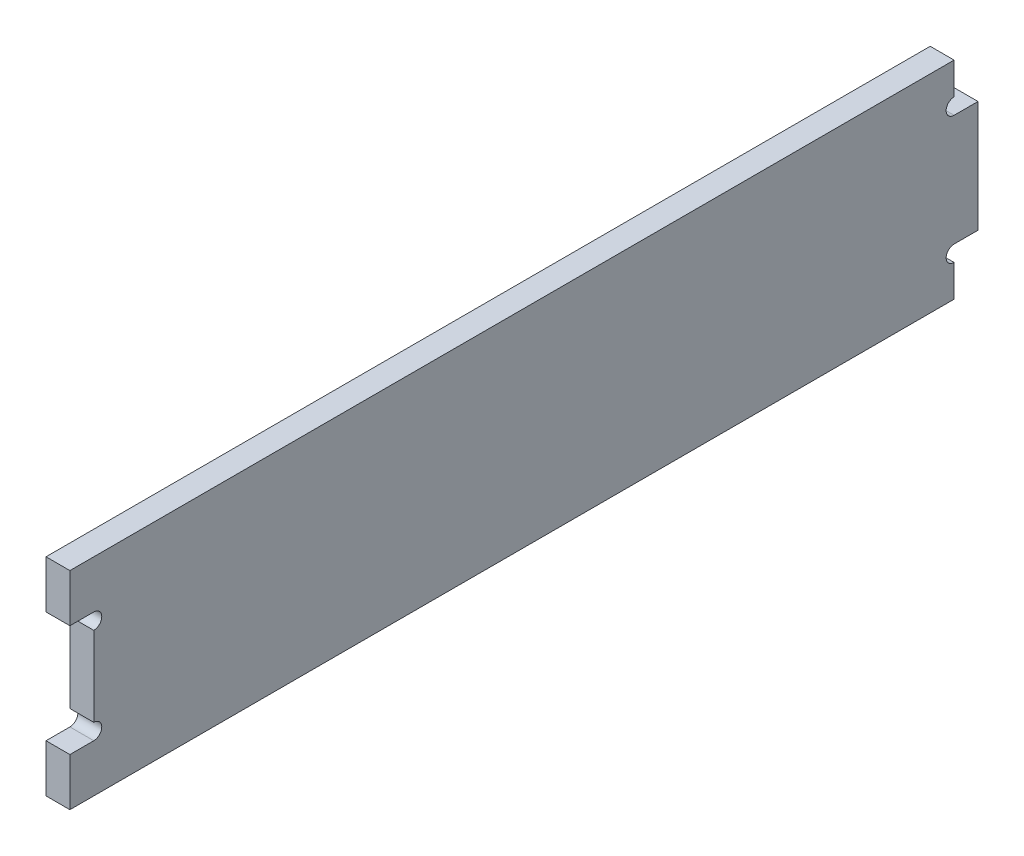
ISO-10303-21;
HEADER;
FILE_DESCRIPTION(('STEP AP214'),'2;1');
FILE_NAME('part.step','',(''),(''),'','','');
FILE_SCHEMA(('AUTOMOTIVE_DESIGN { 1 0 10303 214 1 1 1 1 }'));
ENDSEC;
DATA;
#1=APPLICATION_CONTEXT('core data for automotive mechanical design processes');
#2=APPLICATION_PROTOCOL_DEFINITION('international standard','automotive_design',2000,#1);
#3=PRODUCT_CONTEXT('',#1,'mechanical');
#4=PRODUCT('Part','Part','',(#3));
#5=PRODUCT_RELATED_PRODUCT_CATEGORY('part','',(#4));
#6=PRODUCT_DEFINITION_FORMATION('','',#4);
#7=PRODUCT_DEFINITION_CONTEXT('part definition',#1,'design');
#8=PRODUCT_DEFINITION('design','',#6,#7);
#9=PRODUCT_DEFINITION_SHAPE('','',#8);
#10=(LENGTH_UNIT() NAMED_UNIT(*) SI_UNIT(.MILLI.,.METRE.));
#11=(NAMED_UNIT(*) PLANE_ANGLE_UNIT() SI_UNIT($,.RADIAN.));
#12=(NAMED_UNIT(*) SI_UNIT($,.STERADIAN.) SOLID_ANGLE_UNIT());
#13=UNCERTAINTY_MEASURE_WITH_UNIT(LENGTH_MEASURE(1.E-05),#10,'distance_accuracy_value','');
#14=(GEOMETRIC_REPRESENTATION_CONTEXT(3) GLOBAL_UNCERTAINTY_ASSIGNED_CONTEXT((#13)) GLOBAL_UNIT_ASSIGNED_CONTEXT((#10,
#11,#12)) REPRESENTATION_CONTEXT('',''));
#15=CARTESIAN_POINT('',(0.,0.,0.));
#16=DIRECTION('',(0.,0.,1.));
#17=DIRECTION('',(1.,0.,0.));
#18=AXIS2_PLACEMENT_3D('',#15,#16,#17);
#19=CARTESIAN_POINT('',(3.,0.,0.));
#20=DIRECTION('',(0.,0.,-1.));
#21=DIRECTION('',(-1.,0.,0.));
#22=AXIS2_PLACEMENT_3D('',#19,#20,#21);
#23=PLANE('',#22);
#24=DIRECTION('',(0.,-1.,0.));
#25=VECTOR('',#24,1.);
#26=CARTESIAN_POINT('',(0.,0.,0.));
#27=LINE('',#26,#25);
#28=CARTESIAN_POINT('',(0.,26.,0.));
#29=VERTEX_POINT('',#28);
#30=CARTESIAN_POINT('',(0.,20.,0.));
#31=VERTEX_POINT('',#30);
#32=EDGE_CURVE('E251',#29,#31,#27,.T.);
#33=ORIENTED_EDGE('',*,*,#32,.T.);
#34=DIRECTION('',(1.,0.,0.));
#35=VECTOR('',#34,1.);
#36=CARTESIAN_POINT('',(-2.,20.,0.));
#37=LINE('',#36,#35);
#38=CARTESIAN_POINT('',(3.,20.,0.));
#39=VERTEX_POINT('',#38);
#40=EDGE_CURVE('E176',#31,#39,#37,.T.);
#41=ORIENTED_EDGE('',*,*,#40,.T.);
#42=DIRECTION('',(0.,-1.,0.));
#43=VECTOR('',#42,1.);
#44=CARTESIAN_POINT('',(3.,0.,0.));
#45=LINE('',#44,#43);
#46=CARTESIAN_POINT('',(3.,26.,0.));
#47=VERTEX_POINT('',#46);
#48=EDGE_CURVE('E282',#47,#39,#45,.T.);
#49=ORIENTED_EDGE('',*,*,#48,.F.);
#50=DIRECTION('',(-1.,0.,0.));
#51=VECTOR('',#50,1.);
#52=CARTESIAN_POINT('',(3.,26.,0.));
#53=LINE('',#52,#51);
#54=EDGE_CURVE('E250',#47,#29,#53,.T.);
#55=ORIENTED_EDGE('',*,*,#54,.T.);
#56=EDGE_LOOP('',(#33,#41,#49,#55));
#57=FACE_BOUND('',#56,.T.);
#58=ADVANCED_FACE('F35',(#57),#23,.F.);
#59=CARTESIAN_POINT('',(3.,0.,-111.));
#60=DIRECTION('',(0.,0.,1.));
#61=DIRECTION('',(1.,0.,0.));
#62=AXIS2_PLACEMENT_3D('',#59,#60,#61);
#63=PLANE('',#62);
#64=DIRECTION('',(0.,1.,0.));
#65=VECTOR('',#64,1.);
#66=CARTESIAN_POINT('',(3.,0.,-111.));
#67=LINE('',#66,#65);
#68=CARTESIAN_POINT('',(3.,22.,-111.));
#69=VERTEX_POINT('',#68);
#70=CARTESIAN_POINT('',(3.,26.,-111.));
#71=VERTEX_POINT('',#70);
#72=EDGE_CURVE('E225',#69,#71,#67,.T.);
#73=ORIENTED_EDGE('',*,*,#72,.F.);
#74=DIRECTION('',(1.,0.,0.));
#75=VECTOR('',#74,1.);
#76=CARTESIAN_POINT('',(-7.,22.,-111.));
#77=LINE('',#76,#75);
#78=CARTESIAN_POINT('',(0.,22.,-111.));
#79=VERTEX_POINT('',#78);
#80=EDGE_CURVE('E172',#69,#79,#77,.F.);
#81=ORIENTED_EDGE('',*,*,#80,.T.);
#82=DIRECTION('',(0.,1.,0.));
#83=VECTOR('',#82,1.);
#84=CARTESIAN_POINT('',(0.,0.,-111.));
#85=LINE('',#84,#83);
#86=CARTESIAN_POINT('',(0.,26.,-111.));
#87=VERTEX_POINT('',#86);
#88=EDGE_CURVE('E221',#79,#87,#85,.T.);
#89=ORIENTED_EDGE('',*,*,#88,.T.);
#90=DIRECTION('',(-1.,0.,0.));
#91=VECTOR('',#90,1.);
#92=CARTESIAN_POINT('',(3.,26.,-111.));
#93=LINE('',#92,#91);
#94=EDGE_CURVE('E274',#71,#87,#93,.T.);
#95=ORIENTED_EDGE('',*,*,#94,.F.);
#96=EDGE_LOOP('',(#73,#81,#89,#95));
#97=FACE_BOUND('',#96,.T.);
#98=ADVANCED_FACE('F336',(#97),#63,.F.);
#99=CARTESIAN_POINT('',(3.,6.,0.));
#100=VERTEX_POINT('',#99);
#101=CARTESIAN_POINT('',(3.,0.,0.));
#102=VERTEX_POINT('',#101);
#103=EDGE_CURVE('E290',#100,#102,#45,.T.);
#104=ORIENTED_EDGE('',*,*,#103,.F.);
#105=DIRECTION('',(1.,0.,0.));
#106=VECTOR('',#105,1.);
#107=CARTESIAN_POINT('',(-2.,6.,0.));
#108=LINE('',#107,#106);
#109=CARTESIAN_POINT('',(0.,6.,0.));
#110=VERTEX_POINT('',#109);
#111=EDGE_CURVE('E170',#110,#100,#108,.T.);
#112=ORIENTED_EDGE('',*,*,#111,.F.);
#113=CARTESIAN_POINT('',(0.,0.,0.));
#114=VERTEX_POINT('',#113);
#115=EDGE_CURVE('E203',#110,#114,#27,.T.);
#116=ORIENTED_EDGE('',*,*,#115,.T.);
#117=DIRECTION('',(-1.,0.,0.));
#118=VECTOR('',#117,1.);
#119=CARTESIAN_POINT('',(3.,0.,0.));
#120=LINE('',#119,#118);
#121=EDGE_CURVE('E217',#102,#114,#120,.T.);
#122=ORIENTED_EDGE('',*,*,#121,.F.);
#123=EDGE_LOOP('',(#104,#112,#116,#122));
#124=FACE_BOUND('',#123,.T.);
#125=ADVANCED_FACE('F37',(#124),#23,.F.);
#126=CARTESIAN_POINT('',(3.,0.,0.));
#127=DIRECTION('',(0.,1.,0.));
#128=DIRECTION('',(0.,0.,1.));
#129=AXIS2_PLACEMENT_3D('',#126,#127,#128);
#130=PLANE('',#129);
#131=DIRECTION('',(0.,0.,-1.));
#132=VECTOR('',#131,1.);
#133=CARTESIAN_POINT('',(0.,0.,0.));
#134=LINE('',#133,#132);
#135=CARTESIAN_POINT('',(0.,0.,-111.));
#136=VERTEX_POINT('',#135);
#137=EDGE_CURVE('E224',#114,#136,#134,.T.);
#138=ORIENTED_EDGE('',*,*,#137,.T.);
#139=DIRECTION('',(-1.,0.,0.));
#140=VECTOR('',#139,1.);
#141=CARTESIAN_POINT('',(3.,0.,-111.));
#142=LINE('',#141,#140);
#143=CARTESIAN_POINT('',(3.,0.,-111.));
#144=VERTEX_POINT('',#143);
#145=EDGE_CURVE('E273',#144,#136,#142,.T.);
#146=ORIENTED_EDGE('',*,*,#145,.F.);
#147=DIRECTION('',(0.,0.,-1.));
#148=VECTOR('',#147,1.);
#149=CARTESIAN_POINT('',(3.,0.,0.));
#150=LINE('',#149,#148);
#151=EDGE_CURVE('E247',#102,#144,#150,.T.);
#152=ORIENTED_EDGE('',*,*,#151,.F.);
#153=ORIENTED_EDGE('',*,*,#121,.T.);
#154=EDGE_LOOP('',(#138,#146,#152,#153));
#155=FACE_BOUND('',#154,.T.);
#156=ADVANCED_FACE('F272',(#155),#130,.F.);
#157=CARTESIAN_POINT('',(0.,4.,-111.));
#158=VERTEX_POINT('',#157);
#159=EDGE_CURVE('E223',#136,#158,#85,.T.);
#160=ORIENTED_EDGE('',*,*,#159,.T.);
#161=DIRECTION('',(1.,0.,0.));
#162=VECTOR('',#161,1.);
#163=CARTESIAN_POINT('',(-7.,4.,-111.));
#164=LINE('',#163,#162);
#165=CARTESIAN_POINT('',(3.,4.,-111.));
#166=VERTEX_POINT('',#165);
#167=EDGE_CURVE('E316',#158,#166,#164,.T.);
#168=ORIENTED_EDGE('',*,*,#167,.T.);
#169=EDGE_CURVE('E239',#144,#166,#67,.T.);
#170=ORIENTED_EDGE('',*,*,#169,.F.);
#171=ORIENTED_EDGE('',*,*,#145,.T.);
#172=EDGE_LOOP('',(#160,#168,#170,#171));
#173=FACE_BOUND('',#172,.T.);
#174=ADVANCED_FACE('F361',(#173),#63,.F.);
#175=CARTESIAN_POINT('',(3.,26.,0.));
#176=DIRECTION('',(0.,-1.,0.));
#177=DIRECTION('',(0.,0.,-1.));
#178=AXIS2_PLACEMENT_3D('',#175,#176,#177);
#179=PLANE('',#178);
#180=DIRECTION('',(0.,0.,1.));
#181=VECTOR('',#180,1.);
#182=CARTESIAN_POINT('',(0.,26.,0.));
#183=LINE('',#182,#181);
#184=EDGE_CURVE('E231',#87,#29,#183,.T.);
#185=ORIENTED_EDGE('',*,*,#184,.T.);
#186=ORIENTED_EDGE('',*,*,#54,.F.);
#187=DIRECTION('',(0.,0.,1.));
#188=VECTOR('',#187,1.);
#189=CARTESIAN_POINT('',(3.,26.,0.));
#190=LINE('',#189,#188);
#191=EDGE_CURVE('E242',#71,#47,#190,.T.);
#192=ORIENTED_EDGE('',*,*,#191,.F.);
#193=ORIENTED_EDGE('',*,*,#94,.T.);
#194=EDGE_LOOP('',(#185,#186,#192,#193));
#195=FACE_BOUND('',#194,.T.);
#196=ADVANCED_FACE('F369',(#195),#179,.F.);
#197=CARTESIAN_POINT('',(3.,0.,0.));
#198=DIRECTION('',(-1.,0.,0.));
#199=DIRECTION('',(0.,0.,1.));
#200=AXIS2_PLACEMENT_3D('',#197,#198,#199);
#201=PLANE('',#200);
#202=DIRECTION('',(0.,1.,0.));
#203=VECTOR('',#202,1.);
#204=CARTESIAN_POINT('',(3.,20.,-3.));
#205=LINE('',#204,#203);
#206=CARTESIAN_POINT('',(3.,8.,-3.));
#207=VERTEX_POINT('',#206);
#208=CARTESIAN_POINT('',(3.,18.,-3.));
#209=VERTEX_POINT('',#208);
#210=EDGE_CURVE('E159',#207,#209,#205,.T.);
#211=ORIENTED_EDGE('',*,*,#210,.F.);
#212=CARTESIAN_POINT('',(3.,7.,-3.));
#213=DIRECTION('',(1.,0.,0.));
#214=DIRECTION('',(0.,0.,-1.));
#215=AXIS2_PLACEMENT_3D('',#212,#213,#214);
#216=CIRCLE('',#215,1.);
#217=CARTESIAN_POINT('',(3.,6.,-3.));
#218=VERTEX_POINT('',#217);
#219=EDGE_CURVE('E146',#218,#207,#216,.T.);
#220=ORIENTED_EDGE('',*,*,#219,.F.);
#221=DIRECTION('',(0.,0.,-1.));
#222=VECTOR('',#221,1.);
#223=CARTESIAN_POINT('',(3.,6.,0.));
#224=LINE('',#223,#222);
#225=EDGE_CURVE('E168',#100,#218,#224,.T.);
#226=ORIENTED_EDGE('',*,*,#225,.F.);
#227=ORIENTED_EDGE('',*,*,#103,.T.);
#228=ORIENTED_EDGE('',*,*,#151,.T.);
#229=ORIENTED_EDGE('',*,*,#169,.T.);
#230=CARTESIAN_POINT('',(3.,5.,-111.));
#231=DIRECTION('',(1.,0.,0.));
#232=DIRECTION('',(0.,0.,-1.));
#233=AXIS2_PLACEMENT_3D('',#230,#231,#232);
#234=CIRCLE('',#233,0.999999999999998);
#235=CARTESIAN_POINT('',(3.,5.99999999999999,-111.));
#236=VERTEX_POINT('',#235);
#237=EDGE_CURVE('E312',#236,#166,#234,.T.);
#238=ORIENTED_EDGE('',*,*,#237,.F.);
#239=DIRECTION('',(0.,0.,-1.));
#240=VECTOR('',#239,1.);
#241=CARTESIAN_POINT('',(3.,6.,-111.));
#242=LINE('',#241,#240);
#243=CARTESIAN_POINT('',(3.,6.,-114.));
#244=VERTEX_POINT('',#243);
#245=EDGE_CURVE('E179',#236,#244,#242,.T.);
#246=ORIENTED_EDGE('',*,*,#245,.T.);
#247=DIRECTION('',(0.,1.,0.));
#248=VECTOR('',#247,1.);
#249=CARTESIAN_POINT('',(3.,20.,-114.));
#250=LINE('',#249,#248);
#251=CARTESIAN_POINT('',(3.,20.,-114.));
#252=VERTEX_POINT('',#251);
#253=EDGE_CURVE('E190',#244,#252,#250,.T.);
#254=ORIENTED_EDGE('',*,*,#253,.T.);
#255=DIRECTION('',(0.,0.,1.));
#256=VECTOR('',#255,1.);
#257=CARTESIAN_POINT('',(3.,20.,-111.));
#258=LINE('',#257,#256);
#259=CARTESIAN_POINT('',(3.,20.,-111.));
#260=VERTEX_POINT('',#259);
#261=EDGE_CURVE('E193',#252,#260,#258,.T.);
#262=ORIENTED_EDGE('',*,*,#261,.T.);
#263=CARTESIAN_POINT('',(3.,21.,-111.));
#264=DIRECTION('',(1.,0.,0.));
#265=DIRECTION('',(0.,0.,-1.));
#266=AXIS2_PLACEMENT_3D('',#263,#264,#265);
#267=CIRCLE('',#266,0.999999999999998);
#268=EDGE_CURVE('E326',#69,#260,#267,.T.);
#269=ORIENTED_EDGE('',*,*,#268,.F.);
#270=ORIENTED_EDGE('',*,*,#72,.T.);
#271=ORIENTED_EDGE('',*,*,#191,.T.);
#272=ORIENTED_EDGE('',*,*,#48,.T.);
#273=DIRECTION('',(0.,0.,1.));
#274=VECTOR('',#273,1.);
#275=CARTESIAN_POINT('',(3.,20.,0.));
#276=LINE('',#275,#274);
#277=CARTESIAN_POINT('',(3.,20.,-3.));
#278=VERTEX_POINT('',#277);
#279=EDGE_CURVE('E167',#278,#39,#276,.T.);
#280=ORIENTED_EDGE('',*,*,#279,.F.);
#281=CARTESIAN_POINT('',(3.,19.,-3.));
#282=DIRECTION('',(1.,0.,0.));
#283=DIRECTION('',(0.,0.,-1.));
#284=AXIS2_PLACEMENT_3D('',#281,#282,#283);
#285=CIRCLE('',#284,1.);
#286=EDGE_CURVE('E162',#209,#278,#285,.T.);
#287=ORIENTED_EDGE('',*,*,#286,.F.);
#288=EDGE_LOOP('',(#211,#220,#226,#227,#228,#229,#238,#246,#254,#262,#269,#270,#271,#272,#280,#287));
#289=FACE_BOUND('',#288,.T.);
#290=ADVANCED_FACE('F165',(#289),#201,.F.);
#291=CARTESIAN_POINT('',(0.,0.,0.));
#292=DIRECTION('',(-1.,0.,0.));
#293=DIRECTION('',(0.,0.,1.));
#294=AXIS2_PLACEMENT_3D('',#291,#292,#293);
#295=PLANE('',#294);
#296=CARTESIAN_POINT('',(0.,7.,-3.));
#297=DIRECTION('',(-1.,0.,0.));
#298=DIRECTION('',(0.,0.,1.));
#299=AXIS2_PLACEMENT_3D('',#296,#297,#298);
#300=CIRCLE('',#299,1.);
#301=CARTESIAN_POINT('',(0.,8.,-3.));
#302=VERTEX_POINT('',#301);
#303=CARTESIAN_POINT('',(0.,6.,-3.));
#304=VERTEX_POINT('',#303);
#305=EDGE_CURVE('E57',#302,#304,#300,.T.);
#306=ORIENTED_EDGE('',*,*,#305,.F.);
#307=DIRECTION('',(0.,-1.,0.));
#308=VECTOR('',#307,1.);
#309=CARTESIAN_POINT('',(0.,0.,-3.));
#310=LINE('',#309,#308);
#311=CARTESIAN_POINT('',(0.,18.,-3.));
#312=VERTEX_POINT('',#311);
#313=EDGE_CURVE('E161',#312,#302,#310,.T.);
#314=ORIENTED_EDGE('',*,*,#313,.F.);
#315=CARTESIAN_POINT('',(0.,19.,-3.));
#316=DIRECTION('',(-1.,0.,0.));
#317=DIRECTION('',(0.,0.,1.));
#318=AXIS2_PLACEMENT_3D('',#315,#316,#317);
#319=CIRCLE('',#318,1.);
#320=CARTESIAN_POINT('',(0.,20.,-3.));
#321=VERTEX_POINT('',#320);
#322=EDGE_CURVE('E50',#321,#312,#319,.T.);
#323=ORIENTED_EDGE('',*,*,#322,.F.);
#324=DIRECTION('',(0.,0.,-1.));
#325=VECTOR('',#324,1.);
#326=CARTESIAN_POINT('',(0.,20.,0.));
#327=LINE('',#326,#325);
#328=EDGE_CURVE('E43',#31,#321,#327,.T.);
#329=ORIENTED_EDGE('',*,*,#328,.F.);
#330=ORIENTED_EDGE('',*,*,#32,.F.);
#331=ORIENTED_EDGE('',*,*,#184,.F.);
#332=ORIENTED_EDGE('',*,*,#88,.F.);
#333=CARTESIAN_POINT('',(0.,21.,-111.));
#334=DIRECTION('',(-1.,0.,0.));
#335=DIRECTION('',(0.,0.,1.));
#336=AXIS2_PLACEMENT_3D('',#333,#334,#335);
#337=CIRCLE('',#336,0.999999999999998);
#338=CARTESIAN_POINT('',(0.,20.,-111.));
#339=VERTEX_POINT('',#338);
#340=EDGE_CURVE('E330',#339,#79,#337,.T.);
#341=ORIENTED_EDGE('',*,*,#340,.F.);
#342=DIRECTION('',(0.,0.,1.));
#343=VECTOR('',#342,1.);
#344=CARTESIAN_POINT('',(0.,20.,-111.));
#345=LINE('',#344,#343);
#346=CARTESIAN_POINT('',(0.,20.,-114.));
#347=VERTEX_POINT('',#346);
#348=EDGE_CURVE('E188',#347,#339,#345,.T.);
#349=ORIENTED_EDGE('',*,*,#348,.F.);
#350=DIRECTION('',(0.,1.,0.));
#351=VECTOR('',#350,1.);
#352=CARTESIAN_POINT('',(0.,20.,-114.));
#353=LINE('',#352,#351);
#354=CARTESIAN_POINT('',(0.,6.,-114.));
#355=VERTEX_POINT('',#354);
#356=EDGE_CURVE('E185',#355,#347,#353,.T.);
#357=ORIENTED_EDGE('',*,*,#356,.F.);
#358=DIRECTION('',(0.,0.,-1.));
#359=VECTOR('',#358,1.);
#360=CARTESIAN_POINT('',(0.,6.,-111.));
#361=LINE('',#360,#359);
#362=CARTESIAN_POINT('',(0.,6.,-111.));
#363=VERTEX_POINT('',#362);
#364=EDGE_CURVE('E189',#363,#355,#361,.T.);
#365=ORIENTED_EDGE('',*,*,#364,.F.);
#366=CARTESIAN_POINT('',(0.,5.,-111.));
#367=DIRECTION('',(-1.,0.,0.));
#368=DIRECTION('',(0.,0.,1.));
#369=AXIS2_PLACEMENT_3D('',#366,#367,#368);
#370=CIRCLE('',#369,0.999999999999998);
#371=EDGE_CURVE('E304',#158,#363,#370,.T.);
#372=ORIENTED_EDGE('',*,*,#371,.F.);
#373=ORIENTED_EDGE('',*,*,#159,.F.);
#374=ORIENTED_EDGE('',*,*,#137,.F.);
#375=ORIENTED_EDGE('',*,*,#115,.F.);
#376=DIRECTION('',(0.,0.,1.));
#377=VECTOR('',#376,1.);
#378=CARTESIAN_POINT('',(0.,6.,0.));
#379=LINE('',#378,#377);
#380=EDGE_CURVE('E215',#304,#110,#379,.T.);
#381=ORIENTED_EDGE('',*,*,#380,.F.);
#382=EDGE_LOOP('',(#306,#314,#323,#329,#330,#331,#332,#341,#349,#357,#365,#372,#373,#374,#375,#381));
#383=FACE_BOUND('',#382,.T.);
#384=ADVANCED_FACE('F266',(#383),#295,.T.);
#385=CARTESIAN_POINT('',(0.,20.,-111.));
#386=DIRECTION('',(0.,1.,0.));
#387=DIRECTION('',(0.,0.,1.));
#388=AXIS2_PLACEMENT_3D('',#385,#386,#387);
#389=PLANE('',#388);
#390=ORIENTED_EDGE('',*,*,#261,.F.);
#391=DIRECTION('',(1.,0.,0.));
#392=VECTOR('',#391,1.);
#393=CARTESIAN_POINT('',(0.,20.,-114.));
#394=LINE('',#393,#392);
#395=EDGE_CURVE('E196',#347,#252,#394,.T.);
#396=ORIENTED_EDGE('',*,*,#395,.F.);
#397=ORIENTED_EDGE('',*,*,#348,.T.);
#398=DIRECTION('',(1.,0.,0.));
#399=VECTOR('',#398,1.);
#400=CARTESIAN_POINT('',(0.,20.,-111.));
#401=LINE('',#400,#399);
#402=EDGE_CURVE('E199',#339,#260,#401,.T.);
#403=ORIENTED_EDGE('',*,*,#402,.T.);
#404=EDGE_LOOP('',(#390,#396,#397,#403));
#405=FACE_BOUND('',#404,.T.);
#406=ADVANCED_FACE('F341',(#405),#389,.T.);
#407=CARTESIAN_POINT('',(0.,20.,-114.));
#408=DIRECTION('',(0.,0.,-1.));
#409=DIRECTION('',(-1.,0.,0.));
#410=AXIS2_PLACEMENT_3D('',#407,#408,#409);
#411=PLANE('',#410);
#412=ORIENTED_EDGE('',*,*,#253,.F.);
#413=DIRECTION('',(1.,0.,0.));
#414=VECTOR('',#413,1.);
#415=CARTESIAN_POINT('',(0.,6.,-114.));
#416=LINE('',#415,#414);
#417=EDGE_CURVE('E293',#355,#244,#416,.T.);
#418=ORIENTED_EDGE('',*,*,#417,.F.);
#419=ORIENTED_EDGE('',*,*,#356,.T.);
#420=ORIENTED_EDGE('',*,*,#395,.T.);
#421=EDGE_LOOP('',(#412,#418,#419,#420));
#422=FACE_BOUND('',#421,.T.);
#423=ADVANCED_FACE('F308',(#422),#411,.T.);
#424=CARTESIAN_POINT('',(0.,6.,-111.));
#425=DIRECTION('',(0.,-1.,0.));
#426=DIRECTION('',(0.,0.,-1.));
#427=AXIS2_PLACEMENT_3D('',#424,#425,#426);
#428=PLANE('',#427);
#429=ORIENTED_EDGE('',*,*,#245,.F.);
#430=DIRECTION('',(1.,0.,0.));
#431=VECTOR('',#430,1.);
#432=CARTESIAN_POINT('',(0.,6.,-111.));
#433=LINE('',#432,#431);
#434=EDGE_CURVE('E208',#363,#236,#433,.T.);
#435=ORIENTED_EDGE('',*,*,#434,.F.);
#436=ORIENTED_EDGE('',*,*,#364,.T.);
#437=ORIENTED_EDGE('',*,*,#417,.T.);
#438=EDGE_LOOP('',(#429,#435,#436,#437));
#439=FACE_BOUND('',#438,.T.);
#440=ADVANCED_FACE('F301',(#439),#428,.T.);
#441=CARTESIAN_POINT('',(-2.,20.,0.));
#442=DIRECTION('',(0.,1.,0.));
#443=DIRECTION('',(0.,0.,1.));
#444=AXIS2_PLACEMENT_3D('',#441,#442,#443);
#445=PLANE('',#444);
#446=ORIENTED_EDGE('',*,*,#328,.T.);
#447=DIRECTION('',(1.,0.,0.));
#448=VECTOR('',#447,1.);
#449=CARTESIAN_POINT('',(-2.,20.,-3.));
#450=LINE('',#449,#448);
#451=EDGE_CURVE('E180',#321,#278,#450,.T.);
#452=ORIENTED_EDGE('',*,*,#451,.T.);
#453=ORIENTED_EDGE('',*,*,#279,.T.);
#454=ORIENTED_EDGE('',*,*,#40,.F.);
#455=EDGE_LOOP('',(#446,#452,#453,#454));
#456=FACE_BOUND('',#455,.T.);
#457=ADVANCED_FACE('F289',(#456),#445,.F.);
#458=CARTESIAN_POINT('',(-2.,20.,-3.));
#459=DIRECTION('',(0.,0.,-1.));
#460=DIRECTION('',(0.,1.,0.));
#461=AXIS2_PLACEMENT_3D('',#458,#459,#460);
#462=PLANE('',#461);
#463=ORIENTED_EDGE('',*,*,#313,.T.);
#464=DIRECTION('',(1.,0.,0.));
#465=VECTOR('',#464,1.);
#466=CARTESIAN_POINT('',(-7.,8.,-3.));
#467=LINE('',#466,#465);
#468=EDGE_CURVE('E149',#302,#207,#467,.T.);
#469=ORIENTED_EDGE('',*,*,#468,.T.);
#470=ORIENTED_EDGE('',*,*,#210,.T.);
#471=DIRECTION('',(1.,0.,0.));
#472=VECTOR('',#471,1.);
#473=CARTESIAN_POINT('',(-7.,18.,-3.));
#474=LINE('',#473,#472);
#475=EDGE_CURVE('E11',#209,#312,#474,.F.);
#476=ORIENTED_EDGE('',*,*,#475,.T.);
#477=EDGE_LOOP('',(#463,#469,#470,#476));
#478=FACE_BOUND('',#477,.T.);
#479=ADVANCED_FACE('F158',(#478),#462,.F.);
#480=CARTESIAN_POINT('',(-2.,6.,0.));
#481=DIRECTION('',(0.,-1.,0.));
#482=DIRECTION('',(0.,0.,-1.));
#483=AXIS2_PLACEMENT_3D('',#480,#481,#482);
#484=PLANE('',#483);
#485=ORIENTED_EDGE('',*,*,#380,.T.);
#486=ORIENTED_EDGE('',*,*,#111,.T.);
#487=ORIENTED_EDGE('',*,*,#225,.T.);
#488=DIRECTION('',(1.,0.,0.));
#489=VECTOR('',#488,1.);
#490=CARTESIAN_POINT('',(-2.,6.,-3.));
#491=LINE('',#490,#489);
#492=EDGE_CURVE('E150',#304,#218,#491,.T.);
#493=ORIENTED_EDGE('',*,*,#492,.F.);
#494=EDGE_LOOP('',(#485,#486,#487,#493));
#495=FACE_BOUND('',#494,.T.);
#496=ADVANCED_FACE('F345',(#495),#484,.F.);
#497=CARTESIAN_POINT('',(-7.,21.,-111.));
#498=DIRECTION('',(1.,0.,0.));
#499=DIRECTION('',(0.,0.,-1.));
#500=AXIS2_PLACEMENT_3D('',#497,#498,#499);
#501=CYLINDRICAL_SURFACE('',#500,0.999999999999998);
#502=ORIENTED_EDGE('',*,*,#268,.T.);
#503=ORIENTED_EDGE('',*,*,#402,.F.);
#504=ORIENTED_EDGE('',*,*,#340,.T.);
#505=ORIENTED_EDGE('',*,*,#80,.F.);
#506=EDGE_LOOP('',(#502,#503,#504,#505));
#507=FACE_BOUND('',#506,.T.);
#508=ADVANCED_FACE('F342',(#507),#501,.F.);
#509=CARTESIAN_POINT('',(-7.,5.,-111.));
#510=DIRECTION('',(1.,0.,0.));
#511=DIRECTION('',(0.,0.,-1.));
#512=AXIS2_PLACEMENT_3D('',#509,#510,#511);
#513=CYLINDRICAL_SURFACE('',#512,0.999999999999998);
#514=ORIENTED_EDGE('',*,*,#371,.T.);
#515=ORIENTED_EDGE('',*,*,#434,.T.);
#516=ORIENTED_EDGE('',*,*,#237,.T.);
#517=ORIENTED_EDGE('',*,*,#167,.F.);
#518=EDGE_LOOP('',(#514,#515,#516,#517));
#519=FACE_BOUND('',#518,.T.);
#520=ADVANCED_FACE('F344',(#519),#513,.F.);
#521=CARTESIAN_POINT('',(-7.,19.,-3.));
#522=DIRECTION('',(1.,0.,0.));
#523=DIRECTION('',(0.,0.,-1.));
#524=AXIS2_PLACEMENT_3D('',#521,#522,#523);
#525=CYLINDRICAL_SURFACE('',#524,1.);
#526=ORIENTED_EDGE('',*,*,#322,.T.);
#527=ORIENTED_EDGE('',*,*,#475,.F.);
#528=ORIENTED_EDGE('',*,*,#286,.T.);
#529=ORIENTED_EDGE('',*,*,#451,.F.);
#530=EDGE_LOOP('',(#526,#527,#528,#529));
#531=FACE_BOUND('',#530,.T.);
#532=ADVANCED_FACE('F351',(#531),#525,.F.);
#533=CARTESIAN_POINT('',(-7.,7.,-3.));
#534=DIRECTION('',(1.,0.,0.));
#535=DIRECTION('',(0.,0.,-1.));
#536=AXIS2_PLACEMENT_3D('',#533,#534,#535);
#537=CYLINDRICAL_SURFACE('',#536,1.);
#538=ORIENTED_EDGE('',*,*,#305,.T.);
#539=ORIENTED_EDGE('',*,*,#492,.T.);
#540=ORIENTED_EDGE('',*,*,#219,.T.);
#541=ORIENTED_EDGE('',*,*,#468,.F.);
#542=EDGE_LOOP('',(#538,#539,#540,#541));
#543=FACE_BOUND('',#542,.T.);
#544=ADVANCED_FACE('F148',(#543),#537,.F.);
#545=CLOSED_SHELL('',(#58,#98,#125,#156,#174,#196,#290,#384,#406,#423,#440,#457,#479,#496,#508,
#520,#532,#544));
#546=MANIFOLD_SOLID_BREP('B2',#545);
#547=ADVANCED_BREP_SHAPE_REPRESENTATION('',(#18,#546),#14);
#548=SHAPE_DEFINITION_REPRESENTATION(#9,#547);
ENDSEC;
END-ISO-10303-21;
